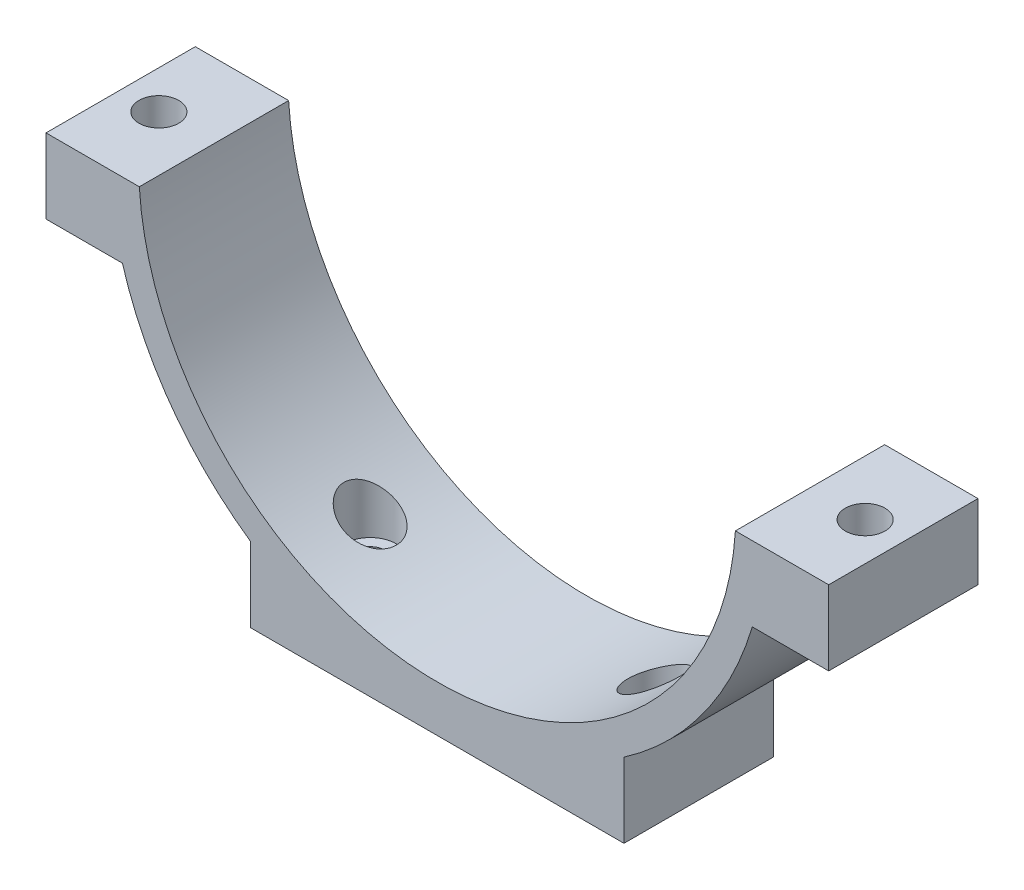
ISO-10303-21;
HEADER;
FILE_DESCRIPTION(('STEP AP214'),'2;1');
FILE_NAME('part.step','',(''),(''),'','','');
FILE_SCHEMA(('AUTOMOTIVE_DESIGN { 1 0 10303 214 1 1 1 1 }'));
ENDSEC;
DATA;
#1=APPLICATION_CONTEXT('core data for automotive mechanical design processes');
#2=APPLICATION_PROTOCOL_DEFINITION('international standard','automotive_design',2000,#1);
#3=PRODUCT_CONTEXT('',#1,'mechanical');
#4=PRODUCT('Part','Part','',(#3));
#5=PRODUCT_RELATED_PRODUCT_CATEGORY('part','',(#4));
#6=PRODUCT_DEFINITION_FORMATION('','',#4);
#7=PRODUCT_DEFINITION_CONTEXT('part definition',#1,'design');
#8=PRODUCT_DEFINITION('design','',#6,#7);
#9=PRODUCT_DEFINITION_SHAPE('','',#8);
#10=(LENGTH_UNIT() NAMED_UNIT(*) SI_UNIT(.MILLI.,.METRE.));
#11=(NAMED_UNIT(*) PLANE_ANGLE_UNIT() SI_UNIT($,.RADIAN.));
#12=(NAMED_UNIT(*) SI_UNIT($,.STERADIAN.) SOLID_ANGLE_UNIT());
#13=UNCERTAINTY_MEASURE_WITH_UNIT(LENGTH_MEASURE(1.E-05),#10,'distance_accuracy_value','');
#14=(GEOMETRIC_REPRESENTATION_CONTEXT(3) GLOBAL_UNCERTAINTY_ASSIGNED_CONTEXT((#13)) GLOBAL_UNIT_ASSIGNED_CONTEXT((#10,
#11,#12)) REPRESENTATION_CONTEXT('',''));
#15=CARTESIAN_POINT('',(0.,0.,0.));
#16=DIRECTION('',(0.,0.,1.));
#17=DIRECTION('',(1.,0.,0.));
#18=AXIS2_PLACEMENT_3D('',#15,#16,#17);
#19=CARTESIAN_POINT('',(0.,50.8,12.7));
#20=DIRECTION('',(0.,0.,-1.));
#21=DIRECTION('',(-1.,0.,0.));
#22=AXIS2_PLACEMENT_3D('',#19,#20,#21);
#23=CYLINDRICAL_SURFACE('',#22,55.88);
#24=CARTESIAN_POINT('',(0.,50.8,12.7));
#25=DIRECTION('',(0.,0.,1.));
#26=DIRECTION('',(1.,0.,0.));
#27=AXIS2_PLACEMENT_3D('',#24,#25,#26);
#28=CIRCLE('',#27,55.88);
#29=CARTESIAN_POINT('',(31.75,4.81617784481154,12.7));
#30=VERTEX_POINT('',#29);
#31=CARTESIAN_POINT('',(53.5775958307201,34.925,12.7));
#32=VERTEX_POINT('',#31);
#33=EDGE_CURVE('E66',#30,#32,#28,.T.);
#34=ORIENTED_EDGE('',*,*,#33,.F.);
#35=DIRECTION('',(0.,0.,-1.));
#36=VECTOR('',#35,1.);
#37=CARTESIAN_POINT('',(31.75,4.81617784481155,77.4575478226284));
#38=LINE('',#37,#36);
#39=CARTESIAN_POINT('',(31.75,4.81617784481155,-12.7));
#40=VERTEX_POINT('',#39);
#41=EDGE_CURVE('E169',#30,#40,#38,.T.);
#42=ORIENTED_EDGE('',*,*,#41,.T.);
#43=CARTESIAN_POINT('',(0.,50.8,-12.7));
#44=DIRECTION('',(0.,0.,1.));
#45=DIRECTION('',(1.,0.,0.));
#46=AXIS2_PLACEMENT_3D('',#43,#44,#45);
#47=CIRCLE('',#46,55.88);
#48=CARTESIAN_POINT('',(53.5775958307201,34.925,-12.7));
#49=VERTEX_POINT('',#48);
#50=EDGE_CURVE('E255',#40,#49,#47,.T.);
#51=ORIENTED_EDGE('',*,*,#50,.T.);
#52=DIRECTION('',(0.,0.,-1.));
#53=VECTOR('',#52,1.);
#54=CARTESIAN_POINT('',(53.5775958307201,34.925,12.7));
#55=LINE('',#54,#53);
#56=EDGE_CURVE('E278',#32,#49,#55,.T.);
#57=ORIENTED_EDGE('',*,*,#56,.F.);
#58=EDGE_LOOP('',(#34,#42,#51,#57));
#59=FACE_BOUND('',#58,.T.);
#60=ADVANCED_FACE('F43',(#59),#23,.T.);
#61=CARTESIAN_POINT('',(0.,50.8,12.7));
#62=DIRECTION('',(0.,0.,-1.));
#63=DIRECTION('',(-1.,0.,0.));
#64=AXIS2_PLACEMENT_3D('',#61,#62,#63);
#65=CYLINDRICAL_SURFACE('',#64,50.8);
#66=CARTESIAN_POINT('',(-24.13,6.09672159673297,-4.445));
#67=CARTESIAN_POINT('',(-23.8622965884025,5.95222436612031,-4.44498407660566));
#68=CARTESIAN_POINT('',(-23.5931324137981,5.81007147513608,-4.42076364967298));
#69=CARTESIAN_POINT('',(-23.1931130885463,5.60329311058451,-4.34726702123152));
#70=CARTESIAN_POINT('',(-23.0603050593596,5.53539799832282,-4.31654010837239));
#71=CARTESIAN_POINT('',(-22.7969182695246,5.40217831559792,-4.24259327603173));
#72=CARTESIAN_POINT('',(-22.6663385582716,5.33685263266228,-4.19937883238954));
#73=CARTESIAN_POINT('',(-22.4078783454364,5.2089054496846,-4.10019263598412));
#74=CARTESIAN_POINT('',(-22.2800136901988,5.14629833498357,-4.04416101396235));
#75=CARTESIAN_POINT('',(-22.0288732518016,5.02458957280132,-3.9195570631005));
#76=CARTESIAN_POINT('',(-21.9055954342558,4.96548636417193,-3.85099037565861));
#77=CARTESIAN_POINT('',(-21.6648564994252,4.85120514046049,-3.70150847877368));
#78=CARTESIAN_POINT('',(-21.5473945963329,4.79602659466217,-3.6205949436172));
#79=CARTESIAN_POINT('',(-21.3196016404435,4.69001879672791,-3.4467673940029));
#80=CARTESIAN_POINT('',(-21.2092697982784,4.63918906293313,-3.35385471139566));
#81=CARTESIAN_POINT('',(-21.0063979875205,4.5465398734143,-3.16521798349879));
#82=CARTESIAN_POINT('',(-20.9131462336546,4.50432116450363,-3.0704547187881));
#83=CARTESIAN_POINT('',(-20.7347378189689,4.42414192181771,-2.87193728272353));
#84=CARTESIAN_POINT('',(-20.6495802024663,4.38618088523945,-2.7681841755812));
#85=CARTESIAN_POINT('',(-20.4883999011909,4.31480623904851,-2.55242975546933));
#86=CARTESIAN_POINT('',(-20.4123727238818,4.28139039194115,-2.44043254304329));
#87=CARTESIAN_POINT('',(-20.2703627583252,4.21933445681855,-2.20899348909732));
#88=CARTESIAN_POINT('',(-20.2043790282237,4.19069392096031,-2.08955234713636));
#89=CARTESIAN_POINT('',(-20.0893172234195,4.14099375057764,-1.85636792379248));
#90=CARTESIAN_POINT('',(-20.0392124422463,4.11946443546741,-1.74323004476316));
#91=CARTESIAN_POINT('',(-19.9484222163785,4.08059405270179,-1.51254507945581));
#92=CARTESIAN_POINT('',(-19.9077358960933,4.06325259571421,-1.39499840422463));
#93=CARTESIAN_POINT('',(-19.8362619560726,4.03287243115332,-1.15643402079996));
#94=CARTESIAN_POINT('',(-19.8054710189903,4.01983228156294,-1.03541749069721));
#95=CARTESIAN_POINT('',(-19.7541343525597,3.99813085853042,-0.790844623402964));
#96=CARTESIAN_POINT('',(-19.7335882502808,3.98946942569489,-0.667288378832187));
#97=CARTESIAN_POINT('',(-19.7039513488054,3.97698705624848,-0.426491466045889));
#98=CARTESIAN_POINT('',(-19.6942206441728,3.97289564335501,-0.309343070110267));
#99=CARTESIAN_POINT('',(-19.6840711548591,3.96862831206445,-0.074531171693421));
#100=CARTESIAN_POINT('',(-19.6836554363986,3.9684536829579,0.0431324876502584));
#101=CARTESIAN_POINT('',(-19.6921465891303,3.97202349616739,0.278000434296726));
#102=CARTESIAN_POINT('',(-19.7010485794338,3.97576588663384,0.395204929857394));
#103=CARTESIAN_POINT('',(-19.7280773298708,3.98714728324949,0.628397920823181));
#104=CARTESIAN_POINT('',(-19.746207490345,3.99478772573186,0.744385951902882));
#105=CARTESIAN_POINT('',(-19.7910752676442,4.01374219072203,0.972095547434391));
#106=CARTESIAN_POINT('',(-19.8176445943448,4.02498442304176,1.08385632601176));
#107=CARTESIAN_POINT('',(-19.8792238576933,4.0511221854664,1.30463233715568));
#108=CARTESIAN_POINT('',(-19.9142368079227,4.06601901995437,1.41364657408723));
#109=CARTESIAN_POINT('',(-19.9923399567946,4.09937748092572,1.62813255238138));
#110=CARTESIAN_POINT('',(-20.0354272766743,4.11783783697375,1.73360554055383));
#111=CARTESIAN_POINT('',(-20.1292904014958,4.15823461047319,1.94042550633387));
#112=CARTESIAN_POINT('',(-20.1800690904013,4.18017233194517,2.04177091809794));
#113=CARTESIAN_POINT('',(-20.2900728995771,4.22794170740777,2.24194458059942));
#114=CARTESIAN_POINT('',(-20.3494633717128,4.25385034727322,2.34066372011122));
#115=CARTESIAN_POINT('',(-20.4752345152505,4.3090385494389,2.53256749772566));
#116=CARTESIAN_POINT('',(-20.5416177174359,4.33831933253308,2.62575011285451));
#117=CARTESIAN_POINT('',(-20.7503606145229,4.43098394168649,2.89617188850964));
#118=CARTESIAN_POINT('',(-20.9024027747183,4.49922843207788,3.06444569560169));
#119=CARTESIAN_POINT('',(-21.2368291760299,4.65162209759368,3.38291715562752));
#120=CARTESIAN_POINT('',(-21.4204862466101,4.73647965450636,3.53142554010948));
#121=CARTESIAN_POINT('',(-21.8050801493031,4.91728382777892,3.79568700866337));
#122=CARTESIAN_POINT('',(-22.0060228448692,5.01323421076025,3.91142892044575));
#123=CARTESIAN_POINT('',(-22.4379414771048,5.22323677011606,4.11791637097919));
#124=CARTESIAN_POINT('',(-22.6699995812205,5.33813982378137,4.20552744197366));
#125=CARTESIAN_POINT('',(-23.1413858922683,5.57626616545378,4.34060542360672));
#126=CARTESIAN_POINT('',(-23.380717127173,5.69949294566615,4.3880553703306));
#127=CARTESIAN_POINT('',(-23.8848655848662,5.96427743178302,4.44618553403665));
#128=CARTESIAN_POINT('',(-24.1498450237465,6.10643791223081,4.45272864524859));
#129=CARTESIAN_POINT('',(-24.6749943464288,6.39420709246072,4.41930925652927));
#130=CARTESIAN_POINT('',(-24.935162154715,6.53981722121184,4.37932714212581));
#131=CARTESIAN_POINT('',(-25.4635749540833,6.84154661185211,4.24959452218949));
#132=CARTESIAN_POINT('',(-25.7309830882987,6.99764259459325,4.15636588906931));
#133=CARTESIAN_POINT('',(-26.2462803883822,7.30445318442739,3.91915589976259));
#134=CARTESIAN_POINT('',(-26.494156652416,7.45516419913589,3.77514133497119));
#135=CARTESIAN_POINT('',(-26.8443193408683,7.67180191415175,3.52294146840896));
#136=CARTESIAN_POINT('',(-26.9572394438585,7.74231918689193,3.43304802101182));
#137=CARTESIAN_POINT('',(-27.1750549487494,7.87945854799194,3.2414001657469));
#138=CARTESIAN_POINT('',(-27.2799548643195,7.94608282223454,3.13965251189257));
#139=CARTESIAN_POINT('',(-27.480411764012,8.07435041793375,2.92477934218267));
#140=CARTESIAN_POINT('',(-27.5759811763305,8.13600034565534,2.81166938013167));
#141=CARTESIAN_POINT('',(-27.7566026564612,8.2532892571489,2.57448490155877));
#142=CARTESIAN_POINT('',(-27.8416591933578,8.30893079384305,2.45041508286468));
#143=CARTESIAN_POINT('',(-27.9772013852717,8.39810406708326,2.2290718777845));
#144=CARTESIAN_POINT('',(-28.0306149551165,8.43340652096233,2.13428962594308));
#145=CARTESIAN_POINT('',(-28.1308359454857,8.49988554291021,1.93991872276949));
#146=CARTESIAN_POINT('',(-28.1776449944668,8.53106312791687,1.84033126439798));
#147=CARTESIAN_POINT('',(-28.2641206870991,8.58883811062599,1.63685298915834));
#148=CARTESIAN_POINT('',(-28.3037896104321,8.61543697009388,1.53296355889048));
#149=CARTESIAN_POINT('',(-28.3754824988333,8.6636278289403,1.32149911466118));
#150=CARTESIAN_POINT('',(-28.4075100499967,8.68522217679877,1.21392585673243));
#151=CARTESIAN_POINT('',(-28.4636527830581,8.72314618392054,0.995140702852389));
#152=CARTESIAN_POINT('',(-28.4877214889638,8.73944490988497,0.883911464307533));
#153=CARTESIAN_POINT('',(-28.5273109097128,8.76628607858609,0.659301969296744));
#154=CARTESIAN_POINT('',(-28.5428352853233,8.77683098649505,0.545922655590008));
#155=CARTESIAN_POINT('',(-28.5650962635376,8.79195960765048,0.317910260365844));
#156=CARTESIAN_POINT('',(-28.5718330897321,8.79654347256977,0.203277210823327));
#157=CARTESIAN_POINT('',(-28.5764040398577,8.79965308386951,-0.026244082611368));
#158=CARTESIAN_POINT('',(-28.5742387976876,8.79817926160588,-0.14113230775074));
#159=CARTESIAN_POINT('',(-28.5616265739691,8.78960204653647,-0.360081145030469));
#160=CARTESIAN_POINT('',(-28.5519243981403,8.78300495598396,-0.464205710436937));
#161=CARTESIAN_POINT('',(-28.5252815571651,8.76491261687461,-0.671126462675339));
#162=CARTESIAN_POINT('',(-28.5083385652219,8.75341579381876,-0.773922211550378));
#163=CARTESIAN_POINT('',(-28.4674449610379,8.72571823522349,-0.977425135113617));
#164=CARTESIAN_POINT('',(-28.4434969509231,8.70951924639572,-1.0781330705044));
#165=CARTESIAN_POINT('',(-28.3888969321371,8.67267381516875,-1.27689625577617));
#166=CARTESIAN_POINT('',(-28.3582423425069,8.65202566059958,-1.37495046802898));
#167=CARTESIAN_POINT('',(-28.2555792982592,8.583070498342,-1.66755284974562));
#168=CARTESIAN_POINT('',(-28.1735575184475,8.52822124762719,-1.85717546776318));
#169=CARTESIAN_POINT('',(-27.9866160045064,8.40422351508027,-2.21950926249328));
#170=CARTESIAN_POINT('',(-27.8816882950328,8.33507005327549,-2.39221451853214));
#171=CARTESIAN_POINT('',(-27.6380364605121,8.17603267630835,-2.73897483312185));
#172=CARTESIAN_POINT('',(-27.4967313989954,8.08463985831481,-2.91052265824228));
#173=CARTESIAN_POINT('',(-27.1939085459778,7.89121691992766,-3.22779714435174));
#174=CARTESIAN_POINT('',(-27.0323778574509,7.78918001924409,-3.37350718514558));
#175=CARTESIAN_POINT('',(-26.6652794943584,7.56047144007014,-3.65964335281814));
#176=CARTESIAN_POINT('',(-26.4568264558297,7.43249626718135,-3.79533098981575));
#177=CARTESIAN_POINT('',(-26.0231771274879,7.17089906382478,-4.02922457497703));
#178=CARTESIAN_POINT('',(-25.7979760828562,7.03727543442301,-4.12741983001092));
#179=CARTESIAN_POINT('',(-25.3360808729736,6.76825879604308,-4.28518363103289));
#180=CARTESIAN_POINT('',(-25.0994103410955,6.63286981320251,-4.34482825477269));
#181=CARTESIAN_POINT('',(-24.6189017074113,6.363239487416,-4.42474562200039));
#182=CARTESIAN_POINT('',(-24.3750629181565,6.22899825614555,-4.44501457670435));
#183=CARTESIAN_POINT('',(-24.13,6.09672159673297,-4.445));
#184=B_SPLINE_CURVE_WITH_KNOTS('',3,(#66,#67,#68,#69,#70,#71,#72,#73,#74,#75,#76,#77,#78,#79,
#80,#81,#82,#83,#84,#85,#86,#87,#88,#89,#90,#91,#92,#93,#94,#95,#96,#97,#98,#99,#100,#101,#102,
#103,#104,#105,#106,#107,#108,#109,#110,#111,#112,#113,#114,#115,#116,#117,#118,#119,#120,#121,
#122,#123,#124,#125,#126,#127,#128,#129,#130,#131,#132,#133,#134,#135,#136,#137,#138,#139,#140,
#141,#142,#143,#144,#145,#146,#147,#148,#149,#150,#151,#152,#153,#154,#155,#156,#157,#158,#159,
#160,#161,#162,#163,#164,#165,#166,#167,#168,#169,#170,#171,#172,#173,#174,#175,#176,#177,#178,
#179,#180,#181,#182,#183),.UNSPECIFIED.,.T.,.F.,(4,2,2,2,2,2,2,2,2,2,2,2,2,2,2,2,2,2,2,2,2,2,2,
2,2,2,2,2,2,2,2,2,2,2,2,2,2,2,2,2,2,2,2,2,2,2,2,2,2,2,2,2,2,2,2,2,2,2,4),(0.,0.911592817086241,
1.3680129732151,1.82423328994751,2.2826297830581,2.74082048072492,3.19894910085388,
3.65702691443241,4.07494075753367,4.49280519568767,4.91046317826871,5.32808196957404,
5.70438331372618,6.08064966082977,6.45678973579778,6.83291611758538,7.18535634356353,
7.53791258084242,7.89028423122117,8.242785815479,8.58865801642477,8.93465384447342,
9.2805265481891,9.62652926321126,9.98037405228044,10.334347346443,11.0417370816872,
11.7915501148936,12.5416185026072,13.3583277673474,14.1753818352308,15.073887480241,
15.9727720616395,16.9384654465628,17.9047914668662,18.38614714013,18.8672298867758,
19.3476628308721,19.8278908325136,20.1707029952057,20.5134304834753,20.8560483517019,
21.1985051117217,21.5429277291232,21.8872026656108,22.2314688421916,22.5757105046833,
22.8896889028289,23.2037682721747,23.5177311195619,23.8318150055702,24.4702623700378,
25.1089323834859,25.8270908844966,26.5457096794163,27.3815428442611,28.2176142177128,
29.0520305670773,29.8865272012163),.UNSPECIFIED.);
#185=CARTESIAN_POINT('',(-24.13,6.09672159673297,-4.445));
#186=VERTEX_POINT('',#185);
#187=EDGE_CURVE('E48',#186,#186,#184,.T.);
#188=ORIENTED_EDGE('',*,*,#187,.T.);
#189=EDGE_LOOP('',(#188));
#190=FACE_BOUND('',#189,.T.);
#191=CARTESIAN_POINT('',(24.13,6.09672159673297,-4.445));
#192=CARTESIAN_POINT('',(24.2970291928062,6.18688091177186,-4.44500057097615));
#193=CARTESIAN_POINT('',(24.4635570464418,6.27798238382926,-4.43558406075736));
#194=CARTESIAN_POINT('',(24.7940887752816,6.4612032595339,-4.39826010974182));
#195=CARTESIAN_POINT('',(24.9580909396828,6.55332328630003,-4.37034065476915));
#196=CARTESIAN_POINT('',(25.2822631597786,6.73774839890508,-4.29627908736488));
#197=CARTESIAN_POINT('',(25.4424250623772,6.83005349309357,-4.2501013166786));
#198=CARTESIAN_POINT('',(25.7571499292934,7.01367310909871,-4.13983306149274));
#199=CARTESIAN_POINT('',(25.9117109688961,7.10498728297765,-4.07573648398541));
#200=CARTESIAN_POINT('',(26.1918379223428,7.27241914559661,-3.94048558588397));
#201=CARTESIAN_POINT('',(26.3183698007463,7.34882852280675,-3.87168383448894));
#202=CARTESIAN_POINT('',(26.5651544940667,7.49926741645956,-3.72141323425925));
#203=CARTESIAN_POINT('',(26.6854083886875,7.57329734127934,-3.63994657321908));
#204=CARTESIAN_POINT('',(26.9183405976812,7.7179655877783,-3.46473124714291));
#205=CARTESIAN_POINT('',(27.0310345121405,7.78861080192172,-3.37100912969005));
#206=CARTESIAN_POINT('',(27.2479326654015,7.92568769808651,-3.17147771568082));
#207=CARTESIAN_POINT('',(27.3521361462578,7.99211900381305,-3.06566734202031));
#208=CARTESIAN_POINT('',(27.6034020101428,8.15349176694677,-2.7830950964941));
#209=CARTESIAN_POINT('',(27.7440276026885,8.24495666452633,-2.59837880540838));
#210=CARTESIAN_POINT('',(27.9338463115298,8.36951541813419,-2.30272746232047));
#211=CARTESIAN_POINT('',(27.9936170870445,8.40894055854871,-2.20104066211682));
#212=CARTESIAN_POINT('',(28.1054840881433,8.48302648499229,-1.99188108586205));
#213=CARTESIAN_POINT('',(28.1575834600423,8.51768922385873,-1.88441070669549));
#214=CARTESIAN_POINT('',(28.2538064520093,8.58192563771272,-1.66339755786775));
#215=CARTESIAN_POINT('',(28.2978634601775,8.61145672033438,-1.54981334879611));
#216=CARTESIAN_POINT('',(28.376803834072,8.66451297340587,-1.31819542669287));
#217=CARTESIAN_POINT('',(28.4116919512423,8.68804125440371,-1.20016405464521));
#218=CARTESIAN_POINT('',(28.4717158494207,8.72859983790988,-0.960608470852297));
#219=CARTESIAN_POINT('',(28.4968561813507,8.74563317263429,-0.839085917557603));
#220=CARTESIAN_POINT('',(28.5369378804131,8.77282108201923,-0.593617039709067));
#221=CARTESIAN_POINT('',(28.5518807766746,8.78297668800936,-0.469671081418965));
#222=CARTESIAN_POINT('',(28.5700333707789,8.79531821130415,-0.23661042268911));
#223=CARTESIAN_POINT('',(28.5745042210031,8.79836066204432,-0.127636914568251));
#224=CARTESIAN_POINT('',(28.5754177867665,8.79898215074686,0.0903985566734327));
#225=CARTESIAN_POINT('',(28.5718579686725,8.79655946448749,0.199460536855323));
#226=CARTESIAN_POINT('',(28.5567630512451,8.78629549734698,0.416706005450227));
#227=CARTESIAN_POINT('',(28.5452326668418,8.77845741990227,0.524889974986363));
#228=CARTESIAN_POINT('',(28.5143703035336,8.75750919561209,0.73966036660748));
#229=CARTESIAN_POINT('',(28.495035360401,8.74439704564259,0.846246165725316));
#230=CARTESIAN_POINT('',(28.4499034890301,8.71385385626661,1.05216422638004));
#231=CARTESIAN_POINT('',(28.4244449465866,8.69664937975393,1.15160454634404));
#232=CARTESIAN_POINT('',(28.3669925801256,8.65791974326021,1.34773011263945));
#233=CARTESIAN_POINT('',(28.3349965274752,8.63639310990229,1.44441440660151));
#234=CARTESIAN_POINT('',(28.2297381898347,8.56578349987682,1.72948790986925));
#235=CARTESIAN_POINT('',(28.1471719738107,8.51064779734581,1.91304882930719));
#236=CARTESIAN_POINT('',(27.9526208034246,8.38177681200171,2.27861456697367));
#237=CARTESIAN_POINT('',(27.838740630496,8.30686422041336,2.45917958419992));
#238=CARTESIAN_POINT('',(27.589666800104,8.14472622475833,2.79877010573307));
#239=CARTESIAN_POINT('',(27.4544622913765,8.05749455428803,2.95778456664282));
#240=CARTESIAN_POINT('',(27.1440706655881,7.85959658283672,3.2756830807175));
#241=CARTESIAN_POINT('',(26.9659344817299,7.7473935599357,3.43072790166112));
#242=CARTESIAN_POINT('',(26.5910483485454,7.51484187416928,3.70888504154441));
#243=CARTESIAN_POINT('',(26.3942873208057,7.39448837550969,3.83197819005665));
#244=CARTESIAN_POINT('',(25.95536917646,7.13040199108374,4.06156468639253));
#245=CARTESIAN_POINT('',(25.7108573197258,6.98589562634921,4.16269279960963));
#246=CARTESIAN_POINT('',(25.2087916403349,6.69511126067216,4.32013500224993));
#247=CARTESIAN_POINT('',(24.9512311827032,6.54883238779376,4.37642604458145));
#248=CARTESIAN_POINT('',(24.4080080561346,6.24674205663265,4.44537568253148));
#249=CARTESIAN_POINT('',(24.1217384905043,6.09109661710103,4.45421225383445));
#250=CARTESIAN_POINT('',(23.6925480473815,5.86304694692932,4.4257549946388));
#251=CARTESIAN_POINT('',(23.5494306968164,5.78788812454114,4.40929382986736));
#252=CARTESIAN_POINT('',(23.264343077372,5.63988452625783,4.36228127009303));
#253=CARTESIAN_POINT('',(23.1223722885709,5.56703865183578,4.3317366742926));
#254=CARTESIAN_POINT('',(22.8439419113565,5.42579844143156,4.2572746604942));
#255=CARTESIAN_POINT('',(22.7074300921241,5.35734096348033,4.2136718552095));
#256=CARTESIAN_POINT('',(22.4379494206333,5.22367910011463,4.1128663948918));
#257=CARTESIAN_POINT('',(22.3049789124485,5.15847318136126,4.05567022488279));
#258=CARTESIAN_POINT('',(22.0438774216724,5.03179570708187,3.92775355444967));
#259=CARTESIAN_POINT('',(21.9157454596238,4.97032339422003,3.85703580893605));
#260=CARTESIAN_POINT('',(21.6657155231406,4.85159502521379,3.70228774981187));
#261=CARTESIAN_POINT('',(21.54381681893,4.79433847515035,3.61825899936651));
#262=CARTESIAN_POINT('',(21.3188355869545,4.6896847556406,3.44580029797012));
#263=CARTESIAN_POINT('',(21.2150614894549,4.64186673519129,3.35852680330776));
#264=CARTESIAN_POINT('',(21.0149737558428,4.5504272918508,3.17382538089977));
#265=CARTESIAN_POINT('',(20.9186591495291,4.50680532303089,3.07639877757349));
#266=CARTESIAN_POINT('',(20.7346603432879,4.4241007163665,2.87203569598517));
#267=CARTESIAN_POINT('',(20.6469715278578,4.38501564887135,2.76510436248524));
#268=CARTESIAN_POINT('',(20.4812718408569,4.31166042025261,2.54245132288998));
#269=CARTESIAN_POINT('',(20.4032599564641,4.27738975518675,2.42673053877728));
#270=CARTESIAN_POINT('',(20.2655931677292,4.21726961309564,2.20001825721523));
#271=CARTESIAN_POINT('',(20.2048706822363,4.19091363412812,2.08980779071626));
#272=CARTESIAN_POINT('',(20.0926897687444,4.14244376679177,1.86388117392282));
#273=CARTESIAN_POINT('',(20.0412303490157,4.12032942428485,1.74816561469805));
#274=CARTESIAN_POINT('',(19.9481921940971,4.08049453571089,1.51214856214973));
#275=CARTESIAN_POINT('',(19.9066096876712,4.06277231251768,1.39184883959234));
#276=CARTESIAN_POINT('',(19.8338041310064,4.03182939667723,1.14759033063737));
#277=CARTESIAN_POINT('',(19.8025805763774,4.0186084848547,1.02363172271563));
#278=CARTESIAN_POINT('',(19.7527847175482,3.99756235096386,0.782336990724489));
#279=CARTESIAN_POINT('',(19.7334496768298,3.98941130584972,0.665186001756088));
#280=CARTESIAN_POINT('',(19.7042012811625,3.97709208679834,0.42946343136418));
#281=CARTESIAN_POINT('',(19.6942910187938,3.97292522019889,0.310891396563262));
#282=CARTESIAN_POINT('',(19.684015809636,3.96860505316154,0.0733304273297975));
#283=CARTESIAN_POINT('',(19.6836453895088,3.96844945132201,-0.0456582288753842));
#284=CARTESIAN_POINT('',(19.6924416289481,3.97214754439659,-0.283264463852424));
#285=CARTESIAN_POINT('',(19.7016117756488,3.97600270526843,-0.401881891038178));
#286=CARTESIAN_POINT('',(19.7289806930964,3.98752802188058,-0.634301009083808));
#287=CARTESIAN_POINT('',(19.7469034069868,3.99508154862821,-0.748141138461703));
#288=CARTESIAN_POINT('',(19.7914621398409,4.01390579584282,-0.973832283757141));
#289=CARTESIAN_POINT('',(19.8181012578892,4.02517783842579,-1.08568257726077));
#290=CARTESIAN_POINT('',(19.8798110219399,4.05137183628973,-1.30654522843327));
#291=CARTESIAN_POINT('',(19.9148783728706,4.06629236521113,-1.41555867677116));
#292=CARTESIAN_POINT('',(19.9931174177421,4.09971022497168,-1.63011459689843));
#293=CARTESIAN_POINT('',(20.0362921439081,4.11820889414286,-1.73565575260894));
#294=CARTESIAN_POINT('',(20.1309315740992,4.15894213986508,-1.94389231923201));
#295=CARTESIAN_POINT('',(20.1824952751279,4.18122148660737,-2.04653404437513));
#296=CARTESIAN_POINT('',(20.2930159050288,4.22922440613674,-2.24693003825322));
#297=CARTESIAN_POINT('',(20.3519755034606,4.25494922279928,-2.34468252429979));
#298=CARTESIAN_POINT('',(20.5391293129214,4.33708255010501,-2.62967907901382));
#299=CARTESIAN_POINT('',(20.6776840243334,4.39848639960289,-2.80884849010832));
#300=CARTESIAN_POINT('',(20.9851916681785,4.5367152506505,-3.15019424611761));
#301=CARTESIAN_POINT('',(21.1553384917257,4.61416925160023,-3.31102930433769));
#302=CARTESIAN_POINT('',(21.5151709778369,4.78069194587516,-3.60197985443261));
#303=CARTESIAN_POINT('',(21.7048675505433,4.8697671320978,-3.73207805817564));
#304=CARTESIAN_POINT('',(22.1146089094537,5.06555153550208,-3.96949403409336));
#305=CARTESIAN_POINT('',(22.3358653665724,5.1731116985897,-4.07400964211284));
#306=CARTESIAN_POINT('',(22.7881250378511,5.39730250566849,-4.24449646581452));
#307=CARTESIAN_POINT('',(23.0191208979793,5.51392636003209,-4.31049622435911));
#308=CARTESIAN_POINT('',(23.3975918190587,5.70876310703673,-4.38676185410746));
#309=CARTESIAN_POINT('',(23.5438834543189,5.78496898333865,-4.40864809786552));
#310=CARTESIAN_POINT('',(23.8369116093119,5.93944890941866,-4.43776918122595));
#311=CARTESIAN_POINT('',(23.9836482523465,6.01772358984867,-4.44499949970807));
#312=CARTESIAN_POINT('',(24.13,6.09672159673297,-4.445));
#313=B_SPLINE_CURVE_WITH_KNOTS('',3,(#191,#192,#193,#194,#195,#196,#197,#198,#199,#200,#201,
#202,#203,#204,#205,#206,#207,#208,#209,#210,#211,#212,#213,#214,#215,#216,#217,#218,#219,#220,
#221,#222,#223,#224,#225,#226,#227,#228,#229,#230,#231,#232,#233,#234,#235,#236,#237,#238,#239,
#240,#241,#242,#243,#244,#245,#246,#247,#248,#249,#250,#251,#252,#253,#254,#255,#256,#257,#258,
#259,#260,#261,#262,#263,#264,#265,#266,#267,#268,#269,#270,#271,#272,#273,#274,#275,#276,#277,
#278,#279,#280,#281,#282,#283,#284,#285,#286,#287,#288,#289,#290,#291,#292,#293,#294,#295,#296,
#297,#298,#299,#300,#301,#302,#303,#304,#305,#306,#307,#308,#309,#310,#311,#312),.UNSPECIFIED.,
.T.,.F.,(4,2,2,2,2,2,2,2,2,2,2,2,2,2,2,2,2,2,2,2,2,2,2,2,2,2,2,2,2,2,2,2,2,2,2,2,2,2,2,2,2,2,2,
2,2,2,2,2,2,2,2,2,2,2,2,2,2,2,2,2,4),(0.,0.569211058482846,1.13879207487542,1.70949101409126,
2.28038424701544,2.76890905741756,3.25734957138679,3.74474903764277,4.23219196674634,
4.97712101227749,5.34985565080285,5.7224369892508,6.09797661922059,6.47332125398917,
6.84849044102556,7.22360335820521,7.55050584253816,7.87751147729563,8.20432383961013,
8.53126044458214,8.84314916918995,9.1551443943797,9.77867051191059,10.4548393908381,
11.1313534670111,11.9127093828682,12.6945330202198,13.595166650943,14.4962629259579,
15.4689530196513,15.9559080903027,16.4426283144213,16.9184547410016,17.3940546178294,
17.8695576981243,18.345004979507,18.77575396958,19.2064468408911,19.6369079882458,
20.0673240439268,20.4525071934455,20.8376490796215,21.2226436723888,21.6076195165372,
21.9642257004826,22.320948858331,22.6774673471811,23.0341161914645,23.380179351924,
23.7263656877791,24.0724168993947,24.4185977957316,24.7692078337464,25.1199447910829,
25.8208015245992,26.5575730505204,27.2947579967539,28.0933805776898,28.8914105709801,
29.3900021365898,29.8887474863881),.UNSPECIFIED.);
#314=CARTESIAN_POINT('',(24.13,6.09672159673297,-4.445));
#315=VERTEX_POINT('',#314);
#316=EDGE_CURVE('E301',#315,#315,#313,.T.);
#317=ORIENTED_EDGE('',*,*,#316,.T.);
#318=EDGE_LOOP('',(#317));
#319=FACE_BOUND('',#318,.T.);
#320=CARTESIAN_POINT('',(0.,50.8,-12.7));
#321=DIRECTION('',(0.,0.,-1.));
#322=DIRECTION('',(1.,0.,0.));
#323=AXIS2_PLACEMENT_3D('',#320,#321,#322);
#324=CIRCLE('',#323,50.8);
#325=CARTESIAN_POINT('',(50.7006841669814,47.625,-12.7));
#326=VERTEX_POINT('',#325);
#327=CARTESIAN_POINT('',(-50.7006841669814,47.625,-12.7));
#328=VERTEX_POINT('',#327);
#329=EDGE_CURVE('E215',#326,#328,#324,.T.);
#330=ORIENTED_EDGE('',*,*,#329,.T.);
#331=DIRECTION('',(0.,0.,-1.));
#332=VECTOR('',#331,1.);
#333=CARTESIAN_POINT('',(-50.7006841669814,47.625,12.7));
#334=LINE('',#333,#332);
#335=CARTESIAN_POINT('',(-50.7006841669814,47.625,12.7));
#336=VERTEX_POINT('',#335);
#337=EDGE_CURVE('E11',#336,#328,#334,.T.);
#338=ORIENTED_EDGE('',*,*,#337,.F.);
#339=CARTESIAN_POINT('',(0.,50.8,12.7));
#340=DIRECTION('',(0.,0.,-1.));
#341=DIRECTION('',(1.,0.,0.));
#342=AXIS2_PLACEMENT_3D('',#339,#340,#341);
#343=CIRCLE('',#342,50.8);
#344=CARTESIAN_POINT('',(50.7006841669814,47.625,12.7));
#345=VERTEX_POINT('',#344);
#346=EDGE_CURVE('E216',#345,#336,#343,.T.);
#347=ORIENTED_EDGE('',*,*,#346,.F.);
#348=DIRECTION('',(0.,0.,-1.));
#349=VECTOR('',#348,1.);
#350=CARTESIAN_POINT('',(50.7006841669814,47.625,12.7));
#351=LINE('',#350,#349);
#352=EDGE_CURVE('E242',#345,#326,#351,.T.);
#353=ORIENTED_EDGE('',*,*,#352,.T.);
#354=EDGE_LOOP('',(#330,#338,#347,#353));
#355=FACE_BOUND('',#354,.T.);
#356=ADVANCED_FACE('F45',(#190,#319,#355),#65,.F.);
#357=CARTESIAN_POINT('',(-50.7006841669814,47.625,12.7));
#358=DIRECTION('',(0.,-1.,0.));
#359=DIRECTION('',(1.,0.,0.));
#360=AXIS2_PLACEMENT_3D('',#357,#358,#359);
#361=PLANE('',#360);
#362=CARTESIAN_POINT('',(-60.0766399988508,47.625,0.));
#363=DIRECTION('',(0.,-1.,0.));
#364=DIRECTION('',(0.,0.,-1.));
#365=AXIS2_PLACEMENT_3D('',#362,#363,#364);
#366=CIRCLE('',#365,3.3782);
#367=CARTESIAN_POINT('',(-60.0766399988508,47.625,-3.3782));
#368=VERTEX_POINT('',#367);
#369=EDGE_CURVE('E199',#368,#368,#366,.T.);
#370=ORIENTED_EDGE('',*,*,#369,.T.);
#371=EDGE_LOOP('',(#370));
#372=FACE_BOUND('',#371,.T.);
#373=DIRECTION('',(-1.,0.,0.));
#374=VECTOR('',#373,1.);
#375=CARTESIAN_POINT('',(-50.7006841669814,47.625,-12.7));
#376=LINE('',#375,#374);
#377=CARTESIAN_POINT('',(-66.5756841669814,47.625,-12.7));
#378=VERTEX_POINT('',#377);
#379=EDGE_CURVE('E246',#328,#378,#376,.T.);
#380=ORIENTED_EDGE('',*,*,#379,.T.);
#381=DIRECTION('',(0.,0.,-1.));
#382=VECTOR('',#381,1.);
#383=CARTESIAN_POINT('',(-66.5756841669814,47.625,12.7));
#384=LINE('',#383,#382);
#385=CARTESIAN_POINT('',(-66.5756841669814,47.625,12.7));
#386=VERTEX_POINT('',#385);
#387=EDGE_CURVE('E58',#386,#378,#384,.T.);
#388=ORIENTED_EDGE('',*,*,#387,.F.);
#389=DIRECTION('',(-1.,0.,0.));
#390=VECTOR('',#389,1.);
#391=CARTESIAN_POINT('',(-50.7006841669814,47.625,12.7));
#392=LINE('',#391,#390);
#393=EDGE_CURVE('E220',#336,#386,#392,.T.);
#394=ORIENTED_EDGE('',*,*,#393,.F.);
#395=ORIENTED_EDGE('',*,*,#337,.T.);
#396=EDGE_LOOP('',(#380,#388,#394,#395));
#397=FACE_BOUND('',#396,.T.);
#398=ADVANCED_FACE('F389',(#372,#397),#361,.F.);
#399=CARTESIAN_POINT('',(-66.5756841669814,47.625,12.7));
#400=DIRECTION('',(1.,0.,0.));
#401=DIRECTION('',(0.,0.,-1.));
#402=AXIS2_PLACEMENT_3D('',#399,#400,#401);
#403=PLANE('',#402);
#404=DIRECTION('',(0.,-1.,0.));
#405=VECTOR('',#404,1.);
#406=CARTESIAN_POINT('',(-66.5756841669814,47.625,-12.7));
#407=LINE('',#406,#405);
#408=CARTESIAN_POINT('',(-66.5756841669814,34.925,-12.7));
#409=VERTEX_POINT('',#408);
#410=EDGE_CURVE('E249',#378,#409,#407,.T.);
#411=ORIENTED_EDGE('',*,*,#410,.T.);
#412=DIRECTION('',(0.,0.,-1.));
#413=VECTOR('',#412,1.);
#414=CARTESIAN_POINT('',(-66.5756841669814,34.925,12.7));
#415=LINE('',#414,#413);
#416=CARTESIAN_POINT('',(-66.5756841669814,34.925,12.7));
#417=VERTEX_POINT('',#416);
#418=EDGE_CURVE('E286',#417,#409,#415,.T.);
#419=ORIENTED_EDGE('',*,*,#418,.F.);
#420=DIRECTION('',(0.,-1.,0.));
#421=VECTOR('',#420,1.);
#422=CARTESIAN_POINT('',(-66.5756841669814,47.625,12.7));
#423=LINE('',#422,#421);
#424=EDGE_CURVE('E224',#386,#417,#423,.T.);
#425=ORIENTED_EDGE('',*,*,#424,.F.);
#426=ORIENTED_EDGE('',*,*,#387,.T.);
#427=EDGE_LOOP('',(#411,#419,#425,#426));
#428=FACE_BOUND('',#427,.T.);
#429=ADVANCED_FACE('F386',(#428),#403,.F.);
#430=CARTESIAN_POINT('',(-66.5756841669814,34.925,12.7));
#431=DIRECTION('',(0.,1.,0.));
#432=DIRECTION('',(0.,0.,1.));
#433=AXIS2_PLACEMENT_3D('',#430,#431,#432);
#434=PLANE('',#433);
#435=CARTESIAN_POINT('',(-60.0766399988508,34.925,0.));
#436=DIRECTION('',(0.,-1.,0.));
#437=DIRECTION('',(0.,0.,-1.));
#438=AXIS2_PLACEMENT_3D('',#435,#436,#437);
#439=CIRCLE('',#438,4.0132);
#440=CARTESIAN_POINT('',(-60.0766399988508,34.925,-4.0132));
#441=VERTEX_POINT('',#440);
#442=EDGE_CURVE('E191',#441,#441,#439,.T.);
#443=ORIENTED_EDGE('',*,*,#442,.F.);
#444=EDGE_LOOP('',(#443));
#445=FACE_BOUND('',#444,.T.);
#446=DIRECTION('',(1.,0.,0.));
#447=VECTOR('',#446,1.);
#448=CARTESIAN_POINT('',(-66.5756841669814,34.925,-12.7));
#449=LINE('',#448,#447);
#450=CARTESIAN_POINT('',(-53.5775958307201,34.925,-12.7));
#451=VERTEX_POINT('',#450);
#452=EDGE_CURVE('E252',#409,#451,#449,.T.);
#453=ORIENTED_EDGE('',*,*,#452,.T.);
#454=DIRECTION('',(0.,0.,-1.));
#455=VECTOR('',#454,1.);
#456=CARTESIAN_POINT('',(-53.5775958307201,34.925,12.7));
#457=LINE('',#456,#455);
#458=CARTESIAN_POINT('',(-53.5775958307201,34.925,12.7));
#459=VERTEX_POINT('',#458);
#460=EDGE_CURVE('E282',#459,#451,#457,.T.);
#461=ORIENTED_EDGE('',*,*,#460,.F.);
#462=DIRECTION('',(1.,0.,0.));
#463=VECTOR('',#462,1.);
#464=CARTESIAN_POINT('',(-66.5756841669814,34.925,12.7));
#465=LINE('',#464,#463);
#466=EDGE_CURVE('E227',#417,#459,#465,.T.);
#467=ORIENTED_EDGE('',*,*,#466,.F.);
#468=ORIENTED_EDGE('',*,*,#418,.T.);
#469=EDGE_LOOP('',(#453,#461,#467,#468));
#470=FACE_BOUND('',#469,.T.);
#471=ADVANCED_FACE('F383',(#445,#470),#434,.F.);
#472=CARTESIAN_POINT('',(-31.75,4.81617784481154,-12.7));
#473=VERTEX_POINT('',#472);
#474=EDGE_CURVE('E256',#451,#473,#47,.T.);
#475=ORIENTED_EDGE('',*,*,#474,.T.);
#476=DIRECTION('',(0.,0.,-1.));
#477=VECTOR('',#476,1.);
#478=CARTESIAN_POINT('',(-31.75,4.81617784481154,77.4575478226284));
#479=LINE('',#478,#477);
#480=CARTESIAN_POINT('',(-31.75,4.81617784481154,12.7));
#481=VERTEX_POINT('',#480);
#482=EDGE_CURVE('E74',#481,#473,#479,.T.);
#483=ORIENTED_EDGE('',*,*,#482,.F.);
#484=EDGE_CURVE('E230',#459,#481,#28,.T.);
#485=ORIENTED_EDGE('',*,*,#484,.F.);
#486=ORIENTED_EDGE('',*,*,#460,.T.);
#487=EDGE_LOOP('',(#475,#483,#485,#486));
#488=FACE_BOUND('',#487,.T.);
#489=ADVANCED_FACE('F379',(#488),#23,.T.);
#490=CARTESIAN_POINT('',(66.5756841669814,34.925,12.7));
#491=DIRECTION('',(0.,1.,0.));
#492=DIRECTION('',(0.,0.,1.));
#493=AXIS2_PLACEMENT_3D('',#490,#491,#492);
#494=PLANE('',#493);
#495=CARTESIAN_POINT('',(60.0766399988508,34.925,0.));
#496=DIRECTION('',(0.,-1.,0.));
#497=DIRECTION('',(0.,0.,-1.));
#498=AXIS2_PLACEMENT_3D('',#495,#496,#497);
#499=CIRCLE('',#498,4.01319999999999);
#500=CARTESIAN_POINT('',(60.0766399988508,34.925,-4.0132));
#501=VERTEX_POINT('',#500);
#502=EDGE_CURVE('E203',#501,#501,#499,.T.);
#503=ORIENTED_EDGE('',*,*,#502,.F.);
#504=EDGE_LOOP('',(#503));
#505=FACE_BOUND('',#504,.T.);
#506=DIRECTION('',(1.,0.,0.));
#507=VECTOR('',#506,1.);
#508=CARTESIAN_POINT('',(66.5756841669814,34.925,-12.7));
#509=LINE('',#508,#507);
#510=CARTESIAN_POINT('',(66.5756841669814,34.925,-12.7));
#511=VERTEX_POINT('',#510);
#512=EDGE_CURVE('E259',#49,#511,#509,.T.);
#513=ORIENTED_EDGE('',*,*,#512,.T.);
#514=DIRECTION('',(0.,0.,-1.));
#515=VECTOR('',#514,1.);
#516=CARTESIAN_POINT('',(66.5756841669814,34.925,12.7));
#517=LINE('',#516,#515);
#518=CARTESIAN_POINT('',(66.5756841669814,34.925,12.7));
#519=VERTEX_POINT('',#518);
#520=EDGE_CURVE('E274',#519,#511,#517,.T.);
#521=ORIENTED_EDGE('',*,*,#520,.F.);
#522=DIRECTION('',(1.,0.,0.));
#523=VECTOR('',#522,1.);
#524=CARTESIAN_POINT('',(66.5756841669814,34.925,12.7));
#525=LINE('',#524,#523);
#526=EDGE_CURVE('E233',#32,#519,#525,.T.);
#527=ORIENTED_EDGE('',*,*,#526,.F.);
#528=ORIENTED_EDGE('',*,*,#56,.T.);
#529=EDGE_LOOP('',(#513,#521,#527,#528));
#530=FACE_BOUND('',#529,.T.);
#531=ADVANCED_FACE('F375',(#505,#530),#494,.F.);
#532=CARTESIAN_POINT('',(66.5756841669814,47.625,12.7));
#533=DIRECTION('',(-1.,0.,0.));
#534=DIRECTION('',(0.,0.,1.));
#535=AXIS2_PLACEMENT_3D('',#532,#533,#534);
#536=PLANE('',#535);
#537=DIRECTION('',(0.,1.,0.));
#538=VECTOR('',#537,1.);
#539=CARTESIAN_POINT('',(66.5756841669814,47.625,-12.7));
#540=LINE('',#539,#538);
#541=CARTESIAN_POINT('',(66.5756841669814,47.625,-12.7));
#542=VERTEX_POINT('',#541);
#543=EDGE_CURVE('E262',#511,#542,#540,.T.);
#544=ORIENTED_EDGE('',*,*,#543,.T.);
#545=DIRECTION('',(0.,0.,-1.));
#546=VECTOR('',#545,1.);
#547=CARTESIAN_POINT('',(66.5756841669814,47.625,12.7));
#548=LINE('',#547,#546);
#549=CARTESIAN_POINT('',(66.5756841669814,47.625,12.7));
#550=VERTEX_POINT('',#549);
#551=EDGE_CURVE('E270',#550,#542,#548,.T.);
#552=ORIENTED_EDGE('',*,*,#551,.F.);
#553=DIRECTION('',(0.,1.,0.));
#554=VECTOR('',#553,1.);
#555=CARTESIAN_POINT('',(66.5756841669814,47.625,12.7));
#556=LINE('',#555,#554);
#557=EDGE_CURVE('E236',#519,#550,#556,.T.);
#558=ORIENTED_EDGE('',*,*,#557,.F.);
#559=ORIENTED_EDGE('',*,*,#520,.T.);
#560=EDGE_LOOP('',(#544,#552,#558,#559));
#561=FACE_BOUND('',#560,.T.);
#562=ADVANCED_FACE('F371',(#561),#536,.F.);
#563=CARTESIAN_POINT('',(50.7006841669814,47.625,12.7));
#564=DIRECTION('',(0.,-1.,0.));
#565=DIRECTION('',(1.,0.,0.));
#566=AXIS2_PLACEMENT_3D('',#563,#564,#565);
#567=PLANE('',#566);
#568=CARTESIAN_POINT('',(60.0766399988508,47.625,0.));
#569=DIRECTION('',(0.,-1.,0.));
#570=DIRECTION('',(0.,0.,-1.));
#571=AXIS2_PLACEMENT_3D('',#568,#569,#570);
#572=CIRCLE('',#571,3.3782);
#573=CARTESIAN_POINT('',(60.0766399988508,47.625,-3.3782));
#574=VERTEX_POINT('',#573);
#575=EDGE_CURVE('E211',#574,#574,#572,.T.);
#576=ORIENTED_EDGE('',*,*,#575,.T.);
#577=EDGE_LOOP('',(#576));
#578=FACE_BOUND('',#577,.T.);
#579=DIRECTION('',(-1.,0.,0.));
#580=VECTOR('',#579,1.);
#581=CARTESIAN_POINT('',(50.7006841669814,47.625,-12.7));
#582=LINE('',#581,#580);
#583=EDGE_CURVE('E221',#542,#326,#582,.T.);
#584=ORIENTED_EDGE('',*,*,#583,.T.);
#585=ORIENTED_EDGE('',*,*,#352,.F.);
#586=DIRECTION('',(-1.,0.,0.));
#587=VECTOR('',#586,1.);
#588=CARTESIAN_POINT('',(50.7006841669814,47.625,12.7));
#589=LINE('',#588,#587);
#590=EDGE_CURVE('E239',#550,#345,#589,.T.);
#591=ORIENTED_EDGE('',*,*,#590,.F.);
#592=ORIENTED_EDGE('',*,*,#551,.T.);
#593=EDGE_LOOP('',(#584,#585,#591,#592));
#594=FACE_BOUND('',#593,.T.);
#595=ADVANCED_FACE('F365',(#578,#594),#567,.F.);
#596=CARTESIAN_POINT('',(0.,50.8,12.7));
#597=DIRECTION('',(0.,0.,1.));
#598=DIRECTION('',(1.,0.,0.));
#599=AXIS2_PLACEMENT_3D('',#596,#597,#598);
#600=PLANE('',#599);
#601=ORIENTED_EDGE('',*,*,#346,.T.);
#602=ORIENTED_EDGE('',*,*,#393,.T.);
#603=ORIENTED_EDGE('',*,*,#424,.T.);
#604=ORIENTED_EDGE('',*,*,#466,.T.);
#605=ORIENTED_EDGE('',*,*,#484,.T.);
#606=DIRECTION('',(0.,1.,0.));
#607=VECTOR('',#606,1.);
#608=CARTESIAN_POINT('',(-31.75,-7.88382215518845,12.7));
#609=LINE('',#608,#607);
#610=CARTESIAN_POINT('',(-31.75,-7.88382215518845,12.7));
#611=VERTEX_POINT('',#610);
#612=EDGE_CURVE('E153',#611,#481,#609,.T.);
#613=ORIENTED_EDGE('',*,*,#612,.F.);
#614=DIRECTION('',(-1.,0.,0.));
#615=VECTOR('',#614,1.);
#616=CARTESIAN_POINT('',(31.75,-7.88382215518845,12.7));
#617=LINE('',#616,#615);
#618=CARTESIAN_POINT('',(31.75,-7.88382215518845,12.7));
#619=VERTEX_POINT('',#618);
#620=EDGE_CURVE('E149',#619,#611,#617,.T.);
#621=ORIENTED_EDGE('',*,*,#620,.F.);
#622=DIRECTION('',(0.,-1.,0.));
#623=VECTOR('',#622,1.);
#624=CARTESIAN_POINT('',(31.75,-7.88382215518845,12.7));
#625=LINE('',#624,#623);
#626=EDGE_CURVE('E173',#30,#619,#625,.T.);
#627=ORIENTED_EDGE('',*,*,#626,.F.);
#628=ORIENTED_EDGE('',*,*,#33,.T.);
#629=ORIENTED_EDGE('',*,*,#526,.T.);
#630=ORIENTED_EDGE('',*,*,#557,.T.);
#631=ORIENTED_EDGE('',*,*,#590,.T.);
#632=EDGE_LOOP('',(#601,#602,#603,#604,#605,#613,#621,#627,#628,#629,#630,#631));
#633=FACE_BOUND('',#632,.T.);
#634=ADVANCED_FACE('F362',(#633),#600,.T.);
#635=CARTESIAN_POINT('',(0.,50.8,-12.7));
#636=DIRECTION('',(0.,0.,1.));
#637=DIRECTION('',(1.,0.,0.));
#638=AXIS2_PLACEMENT_3D('',#635,#636,#637);
#639=PLANE('',#638);
#640=ORIENTED_EDGE('',*,*,#329,.F.);
#641=ORIENTED_EDGE('',*,*,#583,.F.);
#642=ORIENTED_EDGE('',*,*,#543,.F.);
#643=ORIENTED_EDGE('',*,*,#512,.F.);
#644=ORIENTED_EDGE('',*,*,#50,.F.);
#645=DIRECTION('',(0.,-1.,0.));
#646=VECTOR('',#645,1.);
#647=CARTESIAN_POINT('',(31.75,-7.88382215518845,-12.7));
#648=LINE('',#647,#646);
#649=CARTESIAN_POINT('',(31.75,-7.88382215518845,-12.7));
#650=VERTEX_POINT('',#649);
#651=EDGE_CURVE('E161',#40,#650,#648,.T.);
#652=ORIENTED_EDGE('',*,*,#651,.T.);
#653=DIRECTION('',(-1.,0.,0.));
#654=VECTOR('',#653,1.);
#655=CARTESIAN_POINT('',(31.75,-7.88382215518845,-12.7));
#656=LINE('',#655,#654);
#657=CARTESIAN_POINT('',(-31.75,-7.88382215518845,-12.7));
#658=VERTEX_POINT('',#657);
#659=EDGE_CURVE('E148',#650,#658,#656,.T.);
#660=ORIENTED_EDGE('',*,*,#659,.T.);
#661=DIRECTION('',(0.,1.,0.));
#662=VECTOR('',#661,1.);
#663=CARTESIAN_POINT('',(-31.75,-7.88382215518845,-12.7));
#664=LINE('',#663,#662);
#665=EDGE_CURVE('E156',#658,#473,#664,.T.);
#666=ORIENTED_EDGE('',*,*,#665,.T.);
#667=ORIENTED_EDGE('',*,*,#474,.F.);
#668=ORIENTED_EDGE('',*,*,#452,.F.);
#669=ORIENTED_EDGE('',*,*,#410,.F.);
#670=ORIENTED_EDGE('',*,*,#379,.F.);
#671=EDGE_LOOP('',(#640,#641,#642,#643,#644,#652,#660,#666,#667,#668,#669,#670));
#672=FACE_BOUND('',#671,.T.);
#673=ADVANCED_FACE('F166',(#672),#639,.F.);
#674=CARTESIAN_POINT('',(60.0766399988508,34.925,0.));
#675=DIRECTION('',(0.,-1.,0.));
#676=DIRECTION('',(0.,0.,-1.));
#677=AXIS2_PLACEMENT_3D('',#674,#675,#676);
#678=CYLINDRICAL_SURFACE('',#677,3.3782);
#679=ORIENTED_EDGE('',*,*,#575,.F.);
#680=EDGE_LOOP('',(#679));
#681=FACE_BOUND('',#680,.T.);
#682=CARTESIAN_POINT('',(60.0766399988508,35.56,0.));
#683=DIRECTION('',(0.,-1.,0.));
#684=DIRECTION('',(0.,0.,-1.));
#685=AXIS2_PLACEMENT_3D('',#682,#683,#684);
#686=CIRCLE('',#685,3.3782);
#687=CARTESIAN_POINT('',(60.0766399988508,35.56,-3.3782));
#688=VERTEX_POINT('',#687);
#689=EDGE_CURVE('E207',#688,#688,#686,.T.);
#690=ORIENTED_EDGE('',*,*,#689,.T.);
#691=EDGE_LOOP('',(#690));
#692=FACE_BOUND('',#691,.T.);
#693=ADVANCED_FACE('F357',(#681,#692),#678,.F.);
#694=CARTESIAN_POINT('',(60.0766399988508,34.925,0.));
#695=DIRECTION('',(0.,-1.,0.));
#696=DIRECTION('',(0.,0.,-1.));
#697=AXIS2_PLACEMENT_3D('',#694,#695,#696);
#698=CONICAL_SURFACE('',#697,4.01319999999999,0.785398163397443);
#699=ORIENTED_EDGE('',*,*,#689,.F.);
#700=EDGE_LOOP('',(#699));
#701=FACE_BOUND('',#700,.T.);
#702=ORIENTED_EDGE('',*,*,#502,.T.);
#703=EDGE_LOOP('',(#702));
#704=FACE_BOUND('',#703,.T.);
#705=ADVANCED_FACE('F353',(#701,#704),#698,.F.);
#706=CARTESIAN_POINT('',(-60.0766399988508,34.925,0.));
#707=DIRECTION('',(0.,-1.,0.));
#708=DIRECTION('',(0.,0.,-1.));
#709=AXIS2_PLACEMENT_3D('',#706,#707,#708);
#710=CYLINDRICAL_SURFACE('',#709,3.3782);
#711=ORIENTED_EDGE('',*,*,#369,.F.);
#712=EDGE_LOOP('',(#711));
#713=FACE_BOUND('',#712,.T.);
#714=CARTESIAN_POINT('',(-60.0766399988508,35.56,0.));
#715=DIRECTION('',(0.,-1.,0.));
#716=DIRECTION('',(0.,0.,-1.));
#717=AXIS2_PLACEMENT_3D('',#714,#715,#716);
#718=CIRCLE('',#717,3.3782);
#719=CARTESIAN_POINT('',(-60.0766399988508,35.56,-3.3782));
#720=VERTEX_POINT('',#719);
#721=EDGE_CURVE('E195',#720,#720,#718,.T.);
#722=ORIENTED_EDGE('',*,*,#721,.T.);
#723=EDGE_LOOP('',(#722));
#724=FACE_BOUND('',#723,.T.);
#725=ADVANCED_FACE('F349',(#713,#724),#710,.F.);
#726=CARTESIAN_POINT('',(-60.0766399988508,34.925,0.));
#727=DIRECTION('',(0.,-1.,0.));
#728=DIRECTION('',(0.,0.,-1.));
#729=AXIS2_PLACEMENT_3D('',#726,#727,#728);
#730=CONICAL_SURFACE('',#729,4.0132,0.785398163397448);
#731=ORIENTED_EDGE('',*,*,#721,.F.);
#732=EDGE_LOOP('',(#731));
#733=FACE_BOUND('',#732,.T.);
#734=ORIENTED_EDGE('',*,*,#442,.T.);
#735=EDGE_LOOP('',(#734));
#736=FACE_BOUND('',#735,.T.);
#737=ADVANCED_FACE('F345',(#733,#736),#730,.F.);
#738=CARTESIAN_POINT('',(31.75,-7.88382215518845,77.4575478226284));
#739=DIRECTION('',(1.,0.,0.));
#740=DIRECTION('',(0.,0.,-1.));
#741=AXIS2_PLACEMENT_3D('',#738,#739,#740);
#742=PLANE('',#741);
#743=ORIENTED_EDGE('',*,*,#41,.F.);
#744=ORIENTED_EDGE('',*,*,#626,.T.);
#745=DIRECTION('',(0.,0.,-1.));
#746=VECTOR('',#745,1.);
#747=CARTESIAN_POINT('',(31.75,-7.88382215518845,77.4575478226284));
#748=LINE('',#747,#746);
#749=EDGE_CURVE('E183',#619,#650,#748,.T.);
#750=ORIENTED_EDGE('',*,*,#749,.T.);
#751=ORIENTED_EDGE('',*,*,#651,.F.);
#752=EDGE_LOOP('',(#743,#744,#750,#751));
#753=FACE_BOUND('',#752,.T.);
#754=ADVANCED_FACE('F341',(#753),#742,.T.);
#755=CARTESIAN_POINT('',(31.75,-7.88382215518845,77.4575478226284));
#756=DIRECTION('',(0.,-1.,0.));
#757=DIRECTION('',(0.,0.,-1.));
#758=AXIS2_PLACEMENT_3D('',#755,#756,#757);
#759=PLANE('',#758);
#760=CARTESIAN_POINT('',(-24.13,-7.88382215518845,0.));
#761=DIRECTION('',(0.,-1.,0.));
#762=DIRECTION('',(0.,0.,-1.));
#763=AXIS2_PLACEMENT_3D('',#760,#761,#762);
#764=CIRCLE('',#763,3.1877);
#765=CARTESIAN_POINT('',(-24.13,-7.88382215518845,-3.1877));
#766=VERTEX_POINT('',#765);
#767=EDGE_CURVE('E624',#766,#766,#764,.T.);
#768=ORIENTED_EDGE('',*,*,#767,.F.);
#769=EDGE_LOOP('',(#768));
#770=FACE_BOUND('',#769,.T.);
#771=CARTESIAN_POINT('',(24.13,-7.88382215518845,0.));
#772=DIRECTION('',(0.,-1.,0.));
#773=DIRECTION('',(0.,0.,-1.));
#774=AXIS2_PLACEMENT_3D('',#771,#772,#773);
#775=CIRCLE('',#774,3.1877);
#776=CARTESIAN_POINT('',(24.13,-7.88382215518845,-3.1877));
#777=VERTEX_POINT('',#776);
#778=EDGE_CURVE('E623',#777,#777,#775,.T.);
#779=ORIENTED_EDGE('',*,*,#778,.F.);
#780=EDGE_LOOP('',(#779));
#781=FACE_BOUND('',#780,.T.);
#782=ORIENTED_EDGE('',*,*,#749,.F.);
#783=ORIENTED_EDGE('',*,*,#620,.T.);
#784=DIRECTION('',(0.,0.,-1.));
#785=VECTOR('',#784,1.);
#786=CARTESIAN_POINT('',(-31.75,-7.88382215518845,77.4575478226284));
#787=LINE('',#786,#785);
#788=EDGE_CURVE('E143',#611,#658,#787,.T.);
#789=ORIENTED_EDGE('',*,*,#788,.T.);
#790=ORIENTED_EDGE('',*,*,#659,.F.);
#791=EDGE_LOOP('',(#782,#783,#789,#790));
#792=FACE_BOUND('',#791,.T.);
#793=ADVANCED_FACE('F146',(#770,#781,#792),#759,.T.);
#794=CARTESIAN_POINT('',(-31.75,-7.88382215518845,77.4575478226284));
#795=DIRECTION('',(-1.,0.,0.));
#796=DIRECTION('',(0.,0.,1.));
#797=AXIS2_PLACEMENT_3D('',#794,#795,#796);
#798=PLANE('',#797);
#799=ORIENTED_EDGE('',*,*,#788,.F.);
#800=ORIENTED_EDGE('',*,*,#612,.T.);
#801=ORIENTED_EDGE('',*,*,#482,.T.);
#802=ORIENTED_EDGE('',*,*,#665,.F.);
#803=EDGE_LOOP('',(#799,#800,#801,#802));
#804=FACE_BOUND('',#803,.T.);
#805=ADVANCED_FACE('F157',(#804),#798,.T.);
#806=CARTESIAN_POINT('',(24.13,-7.88382215518845,0.));
#807=DIRECTION('',(0.,-1.,0.));
#808=DIRECTION('',(0.,0.,-1.));
#809=AXIS2_PLACEMENT_3D('',#806,#807,#808);
#810=CYLINDRICAL_SURFACE('',#809,2.55269999999999);
#811=CARTESIAN_POINT('',(24.13,-0.263822155188448,0.));
#812=DIRECTION('',(0.,-1.,0.));
#813=DIRECTION('',(0.,0.,-1.));
#814=AXIS2_PLACEMENT_3D('',#811,#812,#813);
#815=CIRCLE('',#814,2.55269999999999);
#816=CARTESIAN_POINT('',(24.13,-0.263822155188448,-2.55269999999999));
#817=VERTEX_POINT('',#816);
#818=EDGE_CURVE('E297',#817,#817,#815,.F.);
#819=ORIENTED_EDGE('',*,*,#818,.T.);
#820=EDGE_LOOP('',(#819));
#821=FACE_BOUND('',#820,.T.);
#822=CARTESIAN_POINT('',(24.13,-7.24882215518845,0.));
#823=DIRECTION('',(0.,-1.,0.));
#824=DIRECTION('',(0.,0.,-1.));
#825=AXIS2_PLACEMENT_3D('',#822,#823,#824);
#826=CIRCLE('',#825,2.5527);
#827=CARTESIAN_POINT('',(24.13,-7.24882215518845,-2.5527));
#828=VERTEX_POINT('',#827);
#829=EDGE_CURVE('E162',#828,#828,#826,.T.);
#830=ORIENTED_EDGE('',*,*,#829,.T.);
#831=EDGE_LOOP('',(#830));
#832=FACE_BOUND('',#831,.T.);
#833=ADVANCED_FACE('F332',(#821,#832),#810,.F.);
#834=CARTESIAN_POINT('',(24.13,-7.88382215518845,0.));
#835=DIRECTION('',(0.,-1.,0.));
#836=DIRECTION('',(0.,0.,-1.));
#837=AXIS2_PLACEMENT_3D('',#834,#835,#836);
#838=CONICAL_SURFACE('',#837,3.1877,0.78539816339745);
#839=ORIENTED_EDGE('',*,*,#829,.F.);
#840=EDGE_LOOP('',(#839));
#841=FACE_BOUND('',#840,.T.);
#842=ORIENTED_EDGE('',*,*,#778,.T.);
#843=EDGE_LOOP('',(#842));
#844=FACE_BOUND('',#843,.T.);
#845=ADVANCED_FACE('F328',(#841,#844),#838,.F.);
#846=CARTESIAN_POINT('',(-24.13,-7.88382215518845,0.));
#847=DIRECTION('',(0.,-1.,0.));
#848=DIRECTION('',(0.,0.,-1.));
#849=AXIS2_PLACEMENT_3D('',#846,#847,#848);
#850=CYLINDRICAL_SURFACE('',#849,2.55269999999999);
#851=CARTESIAN_POINT('',(-24.13,-0.263822155188448,0.));
#852=DIRECTION('',(0.,-1.,0.));
#853=DIRECTION('',(0.,0.,-1.));
#854=AXIS2_PLACEMENT_3D('',#851,#852,#853);
#855=CIRCLE('',#854,2.55269999999999);
#856=CARTESIAN_POINT('',(-24.13,-0.263822155188448,-2.55269999999999));
#857=VERTEX_POINT('',#856);
#858=EDGE_CURVE('E293',#857,#857,#855,.F.);
#859=ORIENTED_EDGE('',*,*,#858,.T.);
#860=EDGE_LOOP('',(#859));
#861=FACE_BOUND('',#860,.T.);
#862=CARTESIAN_POINT('',(-24.13,-7.24882215518845,0.));
#863=DIRECTION('',(0.,-1.,0.));
#864=DIRECTION('',(0.,0.,-1.));
#865=AXIS2_PLACEMENT_3D('',#862,#863,#864);
#866=CIRCLE('',#865,2.5527);
#867=CARTESIAN_POINT('',(-24.13,-7.24882215518845,-2.5527));
#868=VERTEX_POINT('',#867);
#869=EDGE_CURVE('E621',#868,#868,#866,.T.);
#870=ORIENTED_EDGE('',*,*,#869,.T.);
#871=EDGE_LOOP('',(#870));
#872=FACE_BOUND('',#871,.T.);
#873=ADVANCED_FACE('F324',(#861,#872),#850,.F.);
#874=CARTESIAN_POINT('',(-24.13,-7.88382215518845,0.));
#875=DIRECTION('',(0.,-1.,0.));
#876=DIRECTION('',(0.,0.,-1.));
#877=AXIS2_PLACEMENT_3D('',#874,#875,#876);
#878=CONICAL_SURFACE('',#877,3.1877,0.78539816339745);
#879=ORIENTED_EDGE('',*,*,#869,.F.);
#880=EDGE_LOOP('',(#879));
#881=FACE_BOUND('',#880,.T.);
#882=ORIENTED_EDGE('',*,*,#767,.T.);
#883=EDGE_LOOP('',(#882));
#884=FACE_BOUND('',#883,.T.);
#885=ADVANCED_FACE('F321',(#881,#884),#878,.F.);
#886=CARTESIAN_POINT('',(-24.13,25.1361778448115,0.));
#887=DIRECTION('',(0.,-1.,0.));
#888=DIRECTION('',(0.,0.,-1.));
#889=AXIS2_PLACEMENT_3D('',#886,#887,#888);
#890=CYLINDRICAL_SURFACE('',#889,4.445);
#891=CARTESIAN_POINT('',(-24.13,-0.263822155188448,0.));
#892=DIRECTION('',(0.,-1.,0.));
#893=DIRECTION('',(0.,0.,-1.));
#894=AXIS2_PLACEMENT_3D('',#891,#892,#893);
#895=CIRCLE('',#894,4.445);
#896=CARTESIAN_POINT('',(-24.13,-0.263822155188448,-4.445));
#897=VERTEX_POINT('',#896);
#898=EDGE_CURVE('E298',#897,#897,#895,.T.);
#899=ORIENTED_EDGE('',*,*,#898,.T.);
#900=EDGE_LOOP('',(#899));
#901=FACE_BOUND('',#900,.T.);
#902=ORIENTED_EDGE('',*,*,#187,.F.);
#903=EDGE_LOOP('',(#902));
#904=FACE_BOUND('',#903,.T.);
#905=ADVANCED_FACE('F315',(#901,#904),#890,.F.);
#906=CARTESIAN_POINT('',(-24.13,-0.263822155188448,0.));
#907=DIRECTION('',(0.,-1.,0.));
#908=DIRECTION('',(0.,0.,-1.));
#909=AXIS2_PLACEMENT_3D('',#906,#907,#908);
#910=PLANE('',#909);
#911=ORIENTED_EDGE('',*,*,#898,.F.);
#912=EDGE_LOOP('',(#911));
#913=FACE_BOUND('',#912,.T.);
#914=ORIENTED_EDGE('',*,*,#858,.F.);
#915=EDGE_LOOP('',(#914));
#916=FACE_BOUND('',#915,.T.);
#917=ADVANCED_FACE('F313',(#913,#916),#910,.F.);
#918=CARTESIAN_POINT('',(24.13,25.1361778448115,0.));
#919=DIRECTION('',(0.,-1.,0.));
#920=DIRECTION('',(0.,0.,-1.));
#921=AXIS2_PLACEMENT_3D('',#918,#919,#920);
#922=CYLINDRICAL_SURFACE('',#921,4.445);
#923=CARTESIAN_POINT('',(24.13,-0.263822155188448,0.));
#924=DIRECTION('',(0.,-1.,0.));
#925=DIRECTION('',(0.,0.,-1.));
#926=AXIS2_PLACEMENT_3D('',#923,#924,#925);
#927=CIRCLE('',#926,4.445);
#928=CARTESIAN_POINT('',(24.13,-0.263822155188448,-4.445));
#929=VERTEX_POINT('',#928);
#930=EDGE_CURVE('E632',#929,#929,#927,.T.);
#931=ORIENTED_EDGE('',*,*,#930,.T.);
#932=EDGE_LOOP('',(#931));
#933=FACE_BOUND('',#932,.T.);
#934=ORIENTED_EDGE('',*,*,#316,.F.);
#935=EDGE_LOOP('',(#934));
#936=FACE_BOUND('',#935,.T.);
#937=ADVANCED_FACE('F308',(#933,#936),#922,.F.);
#938=CARTESIAN_POINT('',(24.13,-0.263822155188448,0.));
#939=DIRECTION('',(0.,-1.,0.));
#940=DIRECTION('',(0.,0.,-1.));
#941=AXIS2_PLACEMENT_3D('',#938,#939,#940);
#942=PLANE('',#941);
#943=ORIENTED_EDGE('',*,*,#930,.F.);
#944=EDGE_LOOP('',(#943));
#945=FACE_BOUND('',#944,.T.);
#946=ORIENTED_EDGE('',*,*,#818,.F.);
#947=EDGE_LOOP('',(#946));
#948=FACE_BOUND('',#947,.T.);
#949=ADVANCED_FACE('F312',(#945,#948),#942,.F.);
#950=CLOSED_SHELL('',(#60,#356,#398,#429,#471,#489,#531,#562,#595,#634,#673,#693,#705,#725,#737,
#754,#793,#805,#833,#845,#873,#885,#905,#917,#937,#949));
#951=MANIFOLD_SOLID_BREP('B2',#950);
#952=ADVANCED_BREP_SHAPE_REPRESENTATION('',(#18,#951),#14);
#953=SHAPE_DEFINITION_REPRESENTATION(#9,#952);
ENDSEC;
END-ISO-10303-21;
